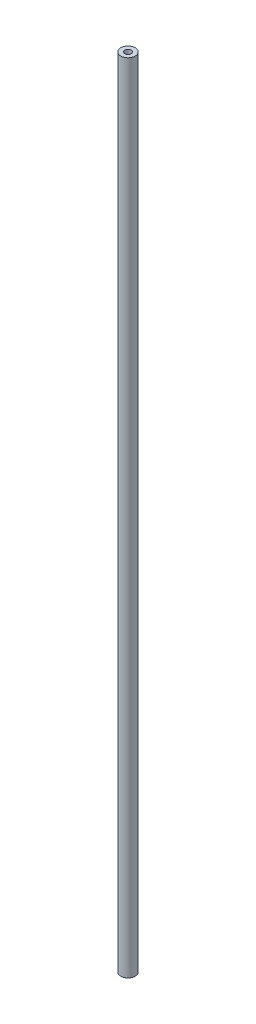
ISO-10303-21;
HEADER;
FILE_DESCRIPTION(('STEP AP214'),'2;1');
FILE_NAME('part.step','',(''),(''),'','','');
FILE_SCHEMA(('AUTOMOTIVE_DESIGN { 1 0 10303 214 1 1 1 1 }'));
ENDSEC;
DATA;
#1=APPLICATION_CONTEXT('core data for automotive mechanical design processes');
#2=APPLICATION_PROTOCOL_DEFINITION('international standard','automotive_design',2000,#1);
#3=PRODUCT_CONTEXT('',#1,'mechanical');
#4=PRODUCT('Part','Part','',(#3));
#5=PRODUCT_RELATED_PRODUCT_CATEGORY('part','',(#4));
#6=PRODUCT_DEFINITION_FORMATION('','',#4);
#7=PRODUCT_DEFINITION_CONTEXT('part definition',#1,'design');
#8=PRODUCT_DEFINITION('design','',#6,#7);
#9=PRODUCT_DEFINITION_SHAPE('','',#8);
#10=(LENGTH_UNIT() NAMED_UNIT(*) SI_UNIT(.MILLI.,.METRE.));
#11=(NAMED_UNIT(*) PLANE_ANGLE_UNIT() SI_UNIT($,.RADIAN.));
#12=(NAMED_UNIT(*) SI_UNIT($,.STERADIAN.) SOLID_ANGLE_UNIT());
#13=UNCERTAINTY_MEASURE_WITH_UNIT(LENGTH_MEASURE(1.E-05),#10,'distance_accuracy_value','');
#14=(GEOMETRIC_REPRESENTATION_CONTEXT(3) GLOBAL_UNCERTAINTY_ASSIGNED_CONTEXT((#13)) GLOBAL_UNIT_ASSIGNED_CONTEXT((#10,
#11,#12)) REPRESENTATION_CONTEXT('',''));
#15=CARTESIAN_POINT('',(0.,0.,0.));
#16=DIRECTION('',(0.,0.,1.));
#17=DIRECTION('',(1.,0.,0.));
#18=AXIS2_PLACEMENT_3D('',#15,#16,#17);
#19=CARTESIAN_POINT('',(0.,27.57,0.));
#20=DIRECTION('',(0.,1.,0.));
#21=DIRECTION('',(0.,0.,-1.));
#22=AXIS2_PLACEMENT_3D('',#19,#20,#21);
#23=PLANE('',#22);
#24=CARTESIAN_POINT('',(0.,27.57,0.));
#25=DIRECTION('',(0.,-1.,0.));
#26=DIRECTION('',(0.,0.,-1.));
#27=AXIS2_PLACEMENT_3D('',#24,#25,#26);
#28=CIRCLE('',#27,0.25);
#29=CARTESIAN_POINT('',(0.,27.57,-0.25));
#30=VERTEX_POINT('',#29);
#31=EDGE_CURVE('E10',#30,#30,#28,.T.);
#32=ORIENTED_EDGE('',*,*,#31,.F.);
#33=EDGE_LOOP('',(#32));
#34=FACE_BOUND('',#33,.T.);
#35=CARTESIAN_POINT('',(0.,27.57,0.));
#36=DIRECTION('',(0.,-1.,0.));
#37=DIRECTION('',(0.,0.,-1.));
#38=AXIS2_PLACEMENT_3D('',#35,#36,#37);
#39=CIRCLE('',#38,0.11);
#40=CARTESIAN_POINT('',(0.,27.57,-0.11));
#41=VERTEX_POINT('',#40);
#42=EDGE_CURVE('E44',#41,#41,#39,.T.);
#43=ORIENTED_EDGE('',*,*,#42,.T.);
#44=EDGE_LOOP('',(#43));
#45=FACE_BOUND('',#44,.T.);
#46=ADVANCED_FACE('F33',(#34,#45),#23,.T.);
#47=CARTESIAN_POINT('',(0.,0.,0.));
#48=DIRECTION('',(0.,1.,0.));
#49=DIRECTION('',(0.,0.,-1.));
#50=AXIS2_PLACEMENT_3D('',#47,#48,#49);
#51=PLANE('',#50);
#52=CARTESIAN_POINT('',(0.,0.,0.));
#53=DIRECTION('',(0.,-1.,0.));
#54=DIRECTION('',(0.,0.,-1.));
#55=AXIS2_PLACEMENT_3D('',#52,#53,#54);
#56=CIRCLE('',#55,0.25);
#57=CARTESIAN_POINT('',(0.,0.,-0.25));
#58=VERTEX_POINT('',#57);
#59=EDGE_CURVE('E37',#58,#58,#56,.T.);
#60=ORIENTED_EDGE('',*,*,#59,.T.);
#61=EDGE_LOOP('',(#60));
#62=FACE_BOUND('',#61,.T.);
#63=CARTESIAN_POINT('',(0.,0.,0.));
#64=DIRECTION('',(0.,-1.,0.));
#65=DIRECTION('',(0.,0.,-1.));
#66=AXIS2_PLACEMENT_3D('',#63,#64,#65);
#67=CIRCLE('',#66,0.11);
#68=CARTESIAN_POINT('',(0.,0.,-0.11));
#69=VERTEX_POINT('',#68);
#70=EDGE_CURVE('E46',#69,#69,#67,.T.);
#71=ORIENTED_EDGE('',*,*,#70,.F.);
#72=EDGE_LOOP('',(#71));
#73=FACE_BOUND('',#72,.T.);
#74=ADVANCED_FACE('F59',(#62,#73),#51,.F.);
#75=CARTESIAN_POINT('',(0.,27.57,0.));
#76=DIRECTION('',(0.,-1.,0.));
#77=DIRECTION('',(0.,0.,1.));
#78=AXIS2_PLACEMENT_3D('',#75,#76,#77);
#79=CYLINDRICAL_SURFACE('',#78,0.25);
#80=ORIENTED_EDGE('',*,*,#31,.T.);
#81=EDGE_LOOP('',(#80));
#82=FACE_BOUND('',#81,.T.);
#83=ORIENTED_EDGE('',*,*,#59,.F.);
#84=EDGE_LOOP('',(#83));
#85=FACE_BOUND('',#84,.T.);
#86=ADVANCED_FACE('F35',(#82,#85),#79,.T.);
#87=CARTESIAN_POINT('',(0.,27.57,0.));
#88=DIRECTION('',(0.,-1.,0.));
#89=DIRECTION('',(0.,0.,1.));
#90=AXIS2_PLACEMENT_3D('',#87,#88,#89);
#91=CYLINDRICAL_SURFACE('',#90,0.11);
#92=ORIENTED_EDGE('',*,*,#42,.F.);
#93=EDGE_LOOP('',(#92));
#94=FACE_BOUND('',#93,.T.);
#95=ORIENTED_EDGE('',*,*,#70,.T.);
#96=EDGE_LOOP('',(#95));
#97=FACE_BOUND('',#96,.T.);
#98=ADVANCED_FACE('F53',(#94,#97),#91,.F.);
#99=CLOSED_SHELL('',(#46,#74,#86,#98));
#100=MANIFOLD_SOLID_BREP('B2',#99);
#101=ADVANCED_BREP_SHAPE_REPRESENTATION('',(#18,#100),#14);
#102=SHAPE_DEFINITION_REPRESENTATION(#9,#101);
ENDSEC;
END-ISO-10303-21;
